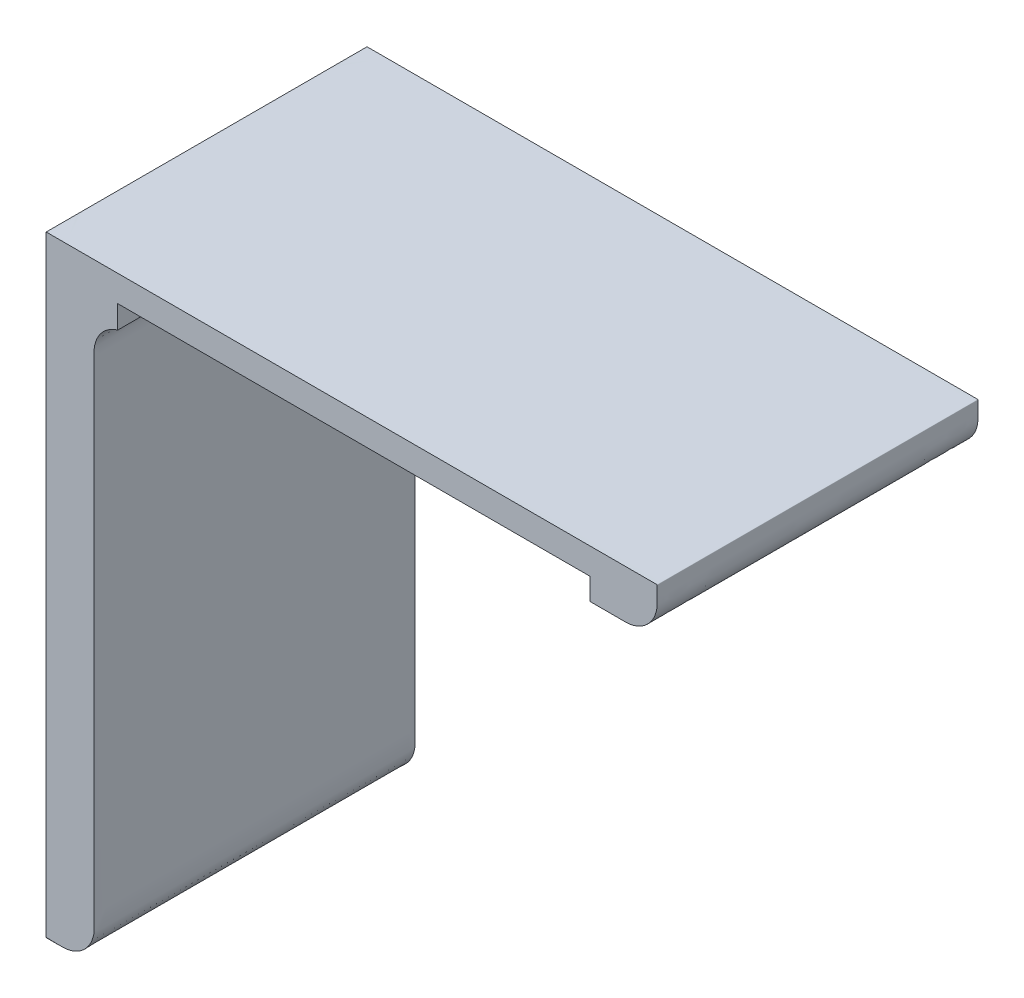
ISO-10303-21;
HEADER;
FILE_DESCRIPTION(('STEP AP214'),'2;1');
FILE_NAME('part.step','',(''),(''),'','','');
FILE_SCHEMA(('AUTOMOTIVE_DESIGN { 1 0 10303 214 1 1 1 1 }'));
ENDSEC;
DATA;
#1=APPLICATION_CONTEXT('core data for automotive mechanical design processes');
#2=APPLICATION_PROTOCOL_DEFINITION('international standard','automotive_design',2000,#1);
#3=PRODUCT_CONTEXT('',#1,'mechanical');
#4=PRODUCT('Part','Part','',(#3));
#5=PRODUCT_RELATED_PRODUCT_CATEGORY('part','',(#4));
#6=PRODUCT_DEFINITION_FORMATION('','',#4);
#7=PRODUCT_DEFINITION_CONTEXT('part definition',#1,'design');
#8=PRODUCT_DEFINITION('design','',#6,#7);
#9=PRODUCT_DEFINITION_SHAPE('','',#8);
#10=(LENGTH_UNIT() NAMED_UNIT(*) SI_UNIT(.MILLI.,.METRE.));
#11=(NAMED_UNIT(*) PLANE_ANGLE_UNIT() SI_UNIT($,.RADIAN.));
#12=(NAMED_UNIT(*) SI_UNIT($,.STERADIAN.) SOLID_ANGLE_UNIT());
#13=UNCERTAINTY_MEASURE_WITH_UNIT(LENGTH_MEASURE(1.E-05),#10,'distance_accuracy_value','');
#14=(GEOMETRIC_REPRESENTATION_CONTEXT(3) GLOBAL_UNCERTAINTY_ASSIGNED_CONTEXT((#13)) GLOBAL_UNIT_ASSIGNED_CONTEXT((#10,
#11,#12)) REPRESENTATION_CONTEXT('',''));
#15=CARTESIAN_POINT('',(0.,0.,0.));
#16=DIRECTION('',(0.,0.,1.));
#17=DIRECTION('',(1.,0.,0.));
#18=AXIS2_PLACEMENT_3D('',#15,#16,#17);
#19=CARTESIAN_POINT('',(18.9059787704305,18.1559787704305,20.));
#20=CARTESIAN_POINT('',(18.9059787704305,18.3978101495289,20.));
#21=CARTESIAN_POINT('',(18.9059787704305,18.6396415286273,20.));
#22=CARTESIAN_POINT('',(18.9059787704305,18.8814729077257,20.));
#23=CARTESIAN_POINT('',(18.9059787704305,18.8853236325474,20.));
#24=CARTESIAN_POINT('',(18.9059787704305,18.8930250821906,20.));
#25=CARTESIAN_POINT('',(18.8930250821906,18.9059787704305,20.));
#26=CARTESIAN_POINT('',(18.8853236325474,18.9059787704305,20.));
#27=CARTESIAN_POINT('',(18.8814729077257,18.9059787704305,20.));
#28=CARTESIAN_POINT('',(6.19781014952889,18.9059787704305,20.));
#29=CARTESIAN_POINT('',(-6.48585260866795,18.9059787704305,20.));
#30=CARTESIAN_POINT('',(-19.1695153668648,18.9059787704305,20.));
#31=CARTESIAN_POINT('',(-19.1733660916864,18.9059787704305,20.));
#32=CARTESIAN_POINT('',(-19.1810675413297,18.9059787704305,20.));
#33=CARTESIAN_POINT('',(-19.1940212295695,18.8930250821906,20.));
#34=CARTESIAN_POINT('',(-19.1940212295695,18.8853236325474,20.));
#35=CARTESIAN_POINT('',(-19.1940212295695,18.8814729077257,20.));
#36=CARTESIAN_POINT('',(-19.1940212295695,6.19781014952888,20.));
#37=CARTESIAN_POINT('',(-19.1940212295695,-6.48585260866796,20.));
#38=CARTESIAN_POINT('',(-19.1940212295695,-19.1695153668648,20.));
#39=CARTESIAN_POINT('',(-19.1940212295695,-19.1733660916864,20.));
#40=CARTESIAN_POINT('',(-19.1940212295695,-19.1810675413297,20.));
#41=CARTESIAN_POINT('',(-19.1810675413297,-19.1940212295695,20.));
#42=CARTESIAN_POINT('',(-19.1733660916864,-19.1940212295695,20.));
#43=CARTESIAN_POINT('',(-19.1695153668648,-19.1940212295695,20.));
#44=CARTESIAN_POINT('',(-18.9276839877664,-19.1940212295695,20.));
#45=CARTESIAN_POINT('',(-18.685852608668,-19.1940212295695,20.));
#46=CARTESIAN_POINT('',(-18.4440212295696,-19.1940212295695,20.));
#47=CARTESIAN_POINT('',(-18.4162434517918,-19.1940212295695,20.));
#48=CARTESIAN_POINT('',(-18.3606878962362,-19.1940212295695,20.));
#49=CARTESIAN_POINT('',(-18.2773545629029,-19.1940212295695,20.));
#50=CARTESIAN_POINT('',(-18.2217990073473,-19.1940212295695,20.));
#51=CARTESIAN_POINT('',(-18.1940212295695,-19.1940212295695,20.));
#52=CARTESIAN_POINT('',(-18.1660825922262,-19.1940212295695,20.));
#53=CARTESIAN_POINT('',(-18.1102053175395,-19.1940212295695,20.));
#54=CARTESIAN_POINT('',(-18.0263712056586,-19.1875699605378,20.));
#55=CARTESIAN_POINT('',(-17.9707886299868,-19.181720345115,20.));
#56=CARTESIAN_POINT('',(-17.9430707985532,-19.1782147385733,20.));
#57=CARTESIAN_POINT('',(-17.2129226472993,-19.0858694141725,20.));
#58=CARTESIAN_POINT('',(-16.627903646982,-18.6393307809212,20.));
#59=CARTESIAN_POINT('',(-16.346262164547,-17.9593880942997,20.));
#60=CARTESIAN_POINT('',(-16.3130809049691,-17.8792814474101,20.));
#61=CARTESIAN_POINT('',(-16.2571370735047,-17.7147525918868,20.));
#62=CARTESIAN_POINT('',(-16.1940212295695,-17.4541416589244,20.));
#63=CARTESIAN_POINT('',(-16.1940212295695,-17.2807280393545,20.));
#64=CARTESIAN_POINT('',(-16.1940212295695,-17.1940212295695,20.));
#65=CARTESIAN_POINT('',(-16.1940212295695,-17.1073144197846,20.));
#66=CARTESIAN_POINT('',(-16.1940212295695,-16.9339008002147,20.));
#67=CARTESIAN_POINT('',(-16.1940212295695,-16.6737803708599,20.));
#68=CARTESIAN_POINT('',(-16.1940212295695,-16.50036675129,20.));
#69=CARTESIAN_POINT('',(-16.1940212295695,-16.413659941505,20.));
#70=CARTESIAN_POINT('',(-16.1940212295695,-6.56723413354804,20.));
#71=CARTESIAN_POINT('',(-16.1940212295695,3.27919167440895,20.));
#72=CARTESIAN_POINT('',(-16.1940212295696,13.1256174823659,20.));
#73=CARTESIAN_POINT('',(-16.1940212295696,13.2123242921509,20.));
#74=CARTESIAN_POINT('',(-16.1940212295696,13.3857379117208,20.));
#75=CARTESIAN_POINT('',(-16.1940212295696,13.6458583410756,20.));
#76=CARTESIAN_POINT('',(-16.1940212295696,13.8192719606455,20.));
#77=CARTESIAN_POINT('',(-16.1940212295696,13.9059787704305,20.));
#78=CARTESIAN_POINT('',(-16.1940212295696,13.9926855802154,20.));
#79=CARTESIAN_POINT('',(-16.1940212295696,14.1660991997853,20.));
#80=CARTESIAN_POINT('',(-16.1309053856344,14.4267101327477,20.));
#81=CARTESIAN_POINT('',(-16.07496155417,14.591238988271,20.));
#82=CARTESIAN_POINT('',(-16.0417802945921,14.6713456351606,20.));
#83=CARTESIAN_POINT('',(-15.8360794525434,15.1679513978261,20.));
#84=CARTESIAN_POINT('',(-15.4559938569652,15.5480369934044,20.));
#85=CARTESIAN_POINT('',(-14.9593880942997,15.753737835453,20.));
#86=CARTESIAN_POINT('',(-14.8792814474101,15.786919095031,20.));
#87=CARTESIAN_POINT('',(-14.7147525918868,15.8428629264953,20.));
#88=CARTESIAN_POINT('',(-14.4541416589244,15.9059787704305,20.));
#89=CARTESIAN_POINT('',(-14.2807280393545,15.9059787704305,20.));
#90=CARTESIAN_POINT('',(-14.1940212295695,15.9059787704305,20.));
#91=CARTESIAN_POINT('',(-14.1073144197846,15.9059787704305,20.));
#92=CARTESIAN_POINT('',(-13.9339008002147,15.9059787704305,20.));
#93=CARTESIAN_POINT('',(-13.6737803708599,15.9059787704305,20.));
#94=CARTESIAN_POINT('',(-13.50036675129,15.9059787704305,20.));
#95=CARTESIAN_POINT('',(-13.413659941505,15.9059787704305,20.));
#96=CARTESIAN_POINT('',(-3.56723413354803,15.9059787704305,20.));
#97=CARTESIAN_POINT('',(6.27919167440896,15.9059787704305,20.));
#98=CARTESIAN_POINT('',(16.1256174823659,15.9059787704305,20.));
#99=CARTESIAN_POINT('',(16.2123242921509,15.9059787704305,20.));
#100=CARTESIAN_POINT('',(16.3857379117208,15.9059787704305,20.));
#101=CARTESIAN_POINT('',(16.6458583410756,15.9059787704305,20.));
#102=CARTESIAN_POINT('',(16.8192719606455,15.9059787704305,20.));
#103=CARTESIAN_POINT('',(16.9059787704305,15.9059787704305,20.));
#104=CARTESIAN_POINT('',(16.9926855802154,15.9059787704305,20.));
#105=CARTESIAN_POINT('',(17.1660991997853,15.9059787704305,20.));
#106=CARTESIAN_POINT('',(17.4267101327477,15.9690946143657,20.));
#107=CARTESIAN_POINT('',(17.591238988271,16.02503844583,20.));
#108=CARTESIAN_POINT('',(17.6713456351606,16.0582197054079,20.));
#109=CARTESIAN_POINT('',(18.3512883217821,16.3398611878429,20.));
#110=CARTESIAN_POINT('',(18.7978269550334,16.9248801881602,20.));
#111=CARTESIAN_POINT('',(18.8901722794342,17.6550283394142,20.));
#112=CARTESIAN_POINT('',(18.8936778859759,17.6827461708477,20.));
#113=CARTESIAN_POINT('',(18.8995275013987,17.7383287465196,20.));
#114=CARTESIAN_POINT('',(18.9059787704305,17.8221628584004,20.));
#115=CARTESIAN_POINT('',(18.9059787704305,17.8780401330871,20.));
#116=CARTESIAN_POINT('',(18.9059787704305,17.9059787704305,20.));
#117=CARTESIAN_POINT('',(18.9059787704305,17.9337565482082,20.));
#118=CARTESIAN_POINT('',(18.9059787704305,17.9893121037638,20.));
#119=CARTESIAN_POINT('',(18.9059787704305,18.0726454370971,20.));
#120=CARTESIAN_POINT('',(18.9059787704305,18.1282009926527,20.));
#121=CARTESIAN_POINT('',(18.9059787704305,18.1559787704305,20.));
#122=(BOUNDED_CURVE() B_SPLINE_CURVE(3,(#19,#20,#21,#22,#23,#24,#25,#26,#27,#28,#29,#30,#31,#32,
#33,#34,#35,#36,#37,#38,#39,#40,#41,#42,#43,#44,#45,#46,#47,#48,#49,#50,#51,#52,#53,#54,#55,#56,
#57,#58,#59,#60,#61,#62,#63,#64,#65,#66,#67,#68,#69,#70,#71,#72,#73,#74,#75,#76,#77,#78,#79,#80,
#81,#82,#83,#84,#85,#86,#87,#88,#89,#90,#91,#92,#93,#94,#95,#96,#97,#98,#99,#100,#101,#102,#103,
#104,#105,#106,#107,#108,#109,#110,#111,#112,#113,#114,#115,#116,#117,#118,#119,#120,#121),
.UNSPECIFIED.,.T.,.F.) B_SPLINE_CURVE_WITH_KNOTS((4,3,1,1,3,3,1,1,3,3,1,1,3,3,1,1,3,1,1,3,3,1,1,
3,1,1,3,3,1,1,3,1,1,3,3,1,1,3,1,1,3,3,1,1,3,1,1,3,3,1,1,3,1,1,4),(0.,0.00485184172848435,
0.0049290984825258,0.00500635523656724,0.00508361199060868,0.259554824410061,0.259632081164102,
0.259709337918143,0.259786594672185,0.514257807091866,0.514335063845908,0.514412320599949,
0.514489577353991,0.51934141908248,0.519898722199426,0.520456025316372,0.521013328433318,
0.521573858861606,0.522134389289895,0.522694919718183,0.536129143548748,0.537868734661477,
0.539608325774207,0.541347916886936,0.543087507999666,0.544827099112395,0.546566690225125,
0.744114666793005,0.745854257905734,0.747593849018464,0.749333440131193,0.751073031243923,
0.752812622356652,0.754552213469382,0.764789205613094,0.766528796725823,0.768268387838553,
0.770007978951282,0.771747570064012,0.773487161176741,0.775226752289471,0.972774728857354,
0.974514319970084,0.976253911082814,0.977993502195543,0.979733093308273,0.981472684421002,
0.983212275533732,0.996646499364297,0.997207029792585,0.997767560220874,0.998328090649162,
0.998885393766108,0.999442696883054,1.),
.UNSPECIFIED.) CURVE() GEOMETRIC_REPRESENTATION_ITEM() RATIONAL_B_SPLINE_CURVE((1.,1.,1.,1.,1.,
1.,1.,1.,1.,1.,1.,1.,1.,1.,1.,1.,1.,1.,1.,1.,1.,1.,1.,1.,1.,1.,1.,1.,1.,1.,1.,1.,1.,1.,1.,1.,1.,
1.,0.909832918896733,0.909832918896733,1.,1.,1.,1.,1.,1.,1.,1.,1.,1.,1.,1.,1.,1.,1.,1.,1.,1.,1.,
1.,1.,1.,1.,1.,0.949253021674191,0.949253021674191,1.,1.,1.,1.,1.,1.,1.,1.,1.,1.,1.,1.,1.,1.,1.,
1.,1.,1.,1.,1.,1.,1.,1.,1.,0.909832918896733,0.909832918896733,1.,1.,1.,1.,1.,1.,1.,1.,1.,1.,1.)) REPRESENTATION_ITEM(''));
#123=DIRECTION('',(0.,0.,-1.));
#124=VECTOR('',#123,1.);
#125=SURFACE_OF_LINEAR_EXTRUSION('',#122,#124);
#126=CARTESIAN_POINT('',(18.9059787704305,18.1559787704305,0.));
#127=CARTESIAN_POINT('',(18.9059787704305,18.3978101495289,0.));
#128=CARTESIAN_POINT('',(18.9059787704305,18.6396415286273,0.));
#129=CARTESIAN_POINT('',(18.9059787704305,18.8814729077257,0.));
#130=CARTESIAN_POINT('',(18.9059787704305,18.8853236325474,0.));
#131=CARTESIAN_POINT('',(18.9059787704305,18.8930250821906,0.));
#132=CARTESIAN_POINT('',(18.8930250821906,18.9059787704305,0.));
#133=CARTESIAN_POINT('',(18.8853236325474,18.9059787704305,0.));
#134=CARTESIAN_POINT('',(18.8814729077257,18.9059787704305,0.));
#135=CARTESIAN_POINT('',(6.19781014952889,18.9059787704305,0.));
#136=CARTESIAN_POINT('',(-6.48585260866795,18.9059787704305,0.));
#137=CARTESIAN_POINT('',(-19.1695153668648,18.9059787704305,0.));
#138=CARTESIAN_POINT('',(-19.1733660916864,18.9059787704305,0.));
#139=CARTESIAN_POINT('',(-19.1810675413297,18.9059787704305,0.));
#140=CARTESIAN_POINT('',(-19.1940212295695,18.8930250821906,0.));
#141=CARTESIAN_POINT('',(-19.1940212295695,18.8853236325474,0.));
#142=CARTESIAN_POINT('',(-19.1940212295695,18.8814729077257,0.));
#143=CARTESIAN_POINT('',(-19.1940212295695,6.19781014952888,0.));
#144=CARTESIAN_POINT('',(-19.1940212295695,-6.48585260866796,0.));
#145=CARTESIAN_POINT('',(-19.1940212295695,-19.1695153668648,0.));
#146=CARTESIAN_POINT('',(-19.1940212295695,-19.1733660916864,0.));
#147=CARTESIAN_POINT('',(-19.1940212295695,-19.1810675413297,0.));
#148=CARTESIAN_POINT('',(-19.1810675413297,-19.1940212295695,0.));
#149=CARTESIAN_POINT('',(-19.1733660916864,-19.1940212295695,0.));
#150=CARTESIAN_POINT('',(-19.1695153668648,-19.1940212295695,0.));
#151=CARTESIAN_POINT('',(-18.9276839877664,-19.1940212295695,0.));
#152=CARTESIAN_POINT('',(-18.685852608668,-19.1940212295695,0.));
#153=CARTESIAN_POINT('',(-18.4440212295696,-19.1940212295695,0.));
#154=CARTESIAN_POINT('',(-18.4162434517918,-19.1940212295695,0.));
#155=CARTESIAN_POINT('',(-18.3606878962362,-19.1940212295695,0.));
#156=CARTESIAN_POINT('',(-18.2773545629029,-19.1940212295695,0.));
#157=CARTESIAN_POINT('',(-18.2217990073473,-19.1940212295695,0.));
#158=CARTESIAN_POINT('',(-18.1940212295695,-19.1940212295695,0.));
#159=CARTESIAN_POINT('',(-18.1660825922262,-19.1940212295695,0.));
#160=CARTESIAN_POINT('',(-18.1102053175395,-19.1940212295695,0.));
#161=CARTESIAN_POINT('',(-18.0263712056586,-19.1875699605378,0.));
#162=CARTESIAN_POINT('',(-17.9707886299868,-19.181720345115,0.));
#163=CARTESIAN_POINT('',(-17.9430707985532,-19.1782147385733,0.));
#164=CARTESIAN_POINT('',(-17.2129226472993,-19.0858694141725,0.));
#165=CARTESIAN_POINT('',(-16.627903646982,-18.6393307809212,0.));
#166=CARTESIAN_POINT('',(-16.346262164547,-17.9593880942997,0.));
#167=CARTESIAN_POINT('',(-16.3130809049691,-17.8792814474101,0.));
#168=CARTESIAN_POINT('',(-16.2571370735047,-17.7147525918868,0.));
#169=CARTESIAN_POINT('',(-16.1940212295695,-17.4541416589244,0.));
#170=CARTESIAN_POINT('',(-16.1940212295695,-17.2807280393545,0.));
#171=CARTESIAN_POINT('',(-16.1940212295695,-17.1940212295695,0.));
#172=CARTESIAN_POINT('',(-16.1940212295695,-17.1073144197846,0.));
#173=CARTESIAN_POINT('',(-16.1940212295695,-16.9339008002147,0.));
#174=CARTESIAN_POINT('',(-16.1940212295695,-16.6737803708599,0.));
#175=CARTESIAN_POINT('',(-16.1940212295695,-16.50036675129,0.));
#176=CARTESIAN_POINT('',(-16.1940212295695,-16.413659941505,0.));
#177=CARTESIAN_POINT('',(-16.1940212295695,-6.56723413354804,0.));
#178=CARTESIAN_POINT('',(-16.1940212295695,3.27919167440895,0.));
#179=CARTESIAN_POINT('',(-16.1940212295696,13.1256174823659,0.));
#180=CARTESIAN_POINT('',(-16.1940212295696,13.2123242921509,0.));
#181=CARTESIAN_POINT('',(-16.1940212295696,13.3857379117208,0.));
#182=CARTESIAN_POINT('',(-16.1940212295696,13.6458583410756,0.));
#183=CARTESIAN_POINT('',(-16.1940212295696,13.8192719606455,0.));
#184=CARTESIAN_POINT('',(-16.1940212295696,13.9059787704305,0.));
#185=CARTESIAN_POINT('',(-16.1940212295696,13.9926855802154,0.));
#186=CARTESIAN_POINT('',(-16.1940212295696,14.1660991997853,0.));
#187=CARTESIAN_POINT('',(-16.1309053856344,14.4267101327477,0.));
#188=CARTESIAN_POINT('',(-16.07496155417,14.591238988271,0.));
#189=CARTESIAN_POINT('',(-16.0417802945921,14.6713456351606,0.));
#190=CARTESIAN_POINT('',(-15.8360794525434,15.1679513978261,0.));
#191=CARTESIAN_POINT('',(-15.4559938569652,15.5480369934044,0.));
#192=CARTESIAN_POINT('',(-14.9593880942997,15.753737835453,0.));
#193=CARTESIAN_POINT('',(-14.8792814474101,15.786919095031,0.));
#194=CARTESIAN_POINT('',(-14.7147525918868,15.8428629264953,0.));
#195=CARTESIAN_POINT('',(-14.4541416589244,15.9059787704305,0.));
#196=CARTESIAN_POINT('',(-14.2807280393545,15.9059787704305,0.));
#197=CARTESIAN_POINT('',(-14.1940212295695,15.9059787704305,0.));
#198=CARTESIAN_POINT('',(-14.1073144197846,15.9059787704305,0.));
#199=CARTESIAN_POINT('',(-13.9339008002147,15.9059787704305,0.));
#200=CARTESIAN_POINT('',(-13.6737803708599,15.9059787704305,0.));
#201=CARTESIAN_POINT('',(-13.50036675129,15.9059787704305,0.));
#202=CARTESIAN_POINT('',(-13.413659941505,15.9059787704305,0.));
#203=CARTESIAN_POINT('',(-3.56723413354803,15.9059787704305,0.));
#204=CARTESIAN_POINT('',(6.27919167440896,15.9059787704305,0.));
#205=CARTESIAN_POINT('',(16.1256174823659,15.9059787704305,0.));
#206=CARTESIAN_POINT('',(16.2123242921509,15.9059787704305,0.));
#207=CARTESIAN_POINT('',(16.3857379117208,15.9059787704305,0.));
#208=CARTESIAN_POINT('',(16.6458583410756,15.9059787704305,0.));
#209=CARTESIAN_POINT('',(16.8192719606455,15.9059787704305,0.));
#210=CARTESIAN_POINT('',(16.9059787704305,15.9059787704305,0.));
#211=CARTESIAN_POINT('',(16.9926855802154,15.9059787704305,0.));
#212=CARTESIAN_POINT('',(17.1660991997853,15.9059787704305,0.));
#213=CARTESIAN_POINT('',(17.4267101327477,15.9690946143657,0.));
#214=CARTESIAN_POINT('',(17.591238988271,16.02503844583,0.));
#215=CARTESIAN_POINT('',(17.6713456351606,16.0582197054079,0.));
#216=CARTESIAN_POINT('',(18.3512883217821,16.3398611878429,0.));
#217=CARTESIAN_POINT('',(18.7978269550334,16.9248801881602,0.));
#218=CARTESIAN_POINT('',(18.8901722794342,17.6550283394142,0.));
#219=CARTESIAN_POINT('',(18.8936778859759,17.6827461708477,0.));
#220=CARTESIAN_POINT('',(18.8995275013987,17.7383287465196,0.));
#221=CARTESIAN_POINT('',(18.9059787704305,17.8221628584004,0.));
#222=CARTESIAN_POINT('',(18.9059787704305,17.8780401330871,0.));
#223=CARTESIAN_POINT('',(18.9059787704305,17.9059787704305,0.));
#224=CARTESIAN_POINT('',(18.9059787704305,17.9337565482082,0.));
#225=CARTESIAN_POINT('',(18.9059787704305,17.9893121037638,0.));
#226=CARTESIAN_POINT('',(18.9059787704305,18.0726454370971,0.));
#227=CARTESIAN_POINT('',(18.9059787704305,18.1282009926527,0.));
#228=CARTESIAN_POINT('',(18.9059787704305,18.1559787704305,0.));
#229=(BOUNDED_CURVE() B_SPLINE_CURVE(3,(#126,#127,#128,#129,#130,#131,#132,#133,#134,#135,#136,
#137,#138,#139,#140,#141,#142,#143,#144,#145,#146,#147,#148,#149,#150,#151,#152,#153,#154,#155,
#156,#157,#158,#159,#160,#161,#162,#163,#164,#165,#166,#167,#168,#169,#170,#171,#172,#173,#174,
#175,#176,#177,#178,#179,#180,#181,#182,#183,#184,#185,#186,#187,#188,#189,#190,#191,#192,#193,
#194,#195,#196,#197,#198,#199,#200,#201,#202,#203,#204,#205,#206,#207,#208,#209,#210,#211,#212,
#213,#214,#215,#216,#217,#218,#219,#220,#221,#222,#223,#224,#225,#226,#227,#228),.UNSPECIFIED.,
.T.,.F.) B_SPLINE_CURVE_WITH_KNOTS((4,3,1,1,3,3,1,1,3,3,1,1,3,3,1,1,3,1,1,3,3,1,1,3,1,1,3,3,1,1,
3,1,1,3,3,1,1,3,1,1,3,3,1,1,3,1,1,3,3,1,1,3,1,1,4),(0.,0.00485184172848435,0.0049290984825258,
0.00500635523656724,0.00508361199060868,0.259554824410061,0.259632081164102,0.259709337918143,
0.259786594672185,0.514257807091866,0.514335063845908,0.514412320599949,0.514489577353991,
0.51934141908248,0.519898722199426,0.520456025316372,0.521013328433318,0.521573858861606,
0.522134389289895,0.522694919718183,0.536129143548748,0.537868734661477,0.539608325774207,
0.541347916886936,0.543087507999666,0.544827099112395,0.546566690225125,0.744114666793005,
0.745854257905734,0.747593849018464,0.749333440131193,0.751073031243923,0.752812622356652,
0.754552213469382,0.764789205613094,0.766528796725823,0.768268387838553,0.770007978951282,
0.771747570064012,0.773487161176741,0.775226752289471,0.972774728857354,0.974514319970084,
0.976253911082814,0.977993502195543,0.979733093308273,0.981472684421002,0.983212275533732,
0.996646499364297,0.997207029792585,0.997767560220874,0.998328090649162,0.998885393766108,
0.999442696883054,1.),
.UNSPECIFIED.) CURVE() GEOMETRIC_REPRESENTATION_ITEM() RATIONAL_B_SPLINE_CURVE((1.,1.,1.,1.,1.,
1.,1.,1.,1.,1.,1.,1.,1.,1.,1.,1.,1.,1.,1.,1.,1.,1.,1.,1.,1.,1.,1.,1.,1.,1.,1.,1.,1.,1.,1.,1.,1.,
1.,0.909832918896733,0.909832918896733,1.,1.,1.,1.,1.,1.,1.,1.,1.,1.,1.,1.,1.,1.,1.,1.,1.,1.,1.,
1.,1.,1.,1.,1.,0.949253021674191,0.949253021674191,1.,1.,1.,1.,1.,1.,1.,1.,1.,1.,1.,1.,1.,1.,1.,
1.,1.,1.,1.,1.,1.,1.,1.,1.,0.909832918896733,0.909832918896733,1.,1.,1.,1.,1.,1.,1.,1.,1.,1.,1.)) REPRESENTATION_ITEM(''));
#230=CARTESIAN_POINT('',(14.7249954714797,15.9059787704305,0.));
#231=VERTEX_POINT('',#230);
#232=CARTESIAN_POINT('',(-14.7249954714797,15.8357302307877,0.));
#233=VERTEX_POINT('',#232);
#234=EDGE_CURVE('E97',#231,#233,#229,.T.);
#235=ORIENTED_EDGE('',*,*,#234,.T.);
#236=DIRECTION('',(0.,0.,-1.));
#237=VECTOR('',#236,1.);
#238=CARTESIAN_POINT('',(-14.7249954714796,15.8357302307877,20.));
#239=LINE('',#238,#237);
#240=CARTESIAN_POINT('',(-14.7249954714797,15.8357302307877,20.));
#241=VERTEX_POINT('',#240);
#242=EDGE_CURVE('E55',#233,#241,#239,.F.);
#243=ORIENTED_EDGE('',*,*,#242,.T.);
#244=CARTESIAN_POINT('',(14.7249954714797,15.9059787704305,20.));
#245=VERTEX_POINT('',#244);
#246=EDGE_CURVE('E98',#245,#241,#122,.T.);
#247=ORIENTED_EDGE('',*,*,#246,.F.);
#248=DIRECTION('',(0.,0.,-1.));
#249=VECTOR('',#248,1.);
#250=CARTESIAN_POINT('',(14.7249954714796,15.9059787704305,20.));
#251=LINE('',#250,#249);
#252=EDGE_CURVE('E85',#245,#231,#251,.T.);
#253=ORIENTED_EDGE('',*,*,#252,.T.);
#254=EDGE_LOOP('',(#235,#243,#247,#253));
#255=FACE_BOUND('',#254,.T.);
#256=ADVANCED_FACE('F33',(#255),#125,.F.);
#257=CARTESIAN_POINT('',(-19.1940212295695,-17.0375506337411,20.));
#258=DIRECTION('',(0.,0.,-1.));
#259=DIRECTION('',(-1.,0.,0.));
#260=AXIS2_PLACEMENT_3D('',#257,#258,#259);
#261=PLANE('',#260);
#262=ORIENTED_EDGE('',*,*,#246,.T.);
#263=DIRECTION('',(0.,-1.,0.));
#264=VECTOR('',#263,1.);
#265=CARTESIAN_POINT('',(-14.7249954714797,-17.267544050803,20.));
#266=LINE('',#265,#264);
#267=CARTESIAN_POINT('',(-14.7249954714797,17.267544050803,20.));
#268=VERTEX_POINT('',#267);
#269=EDGE_CURVE('E89',#268,#241,#266,.T.);
#270=ORIENTED_EDGE('',*,*,#269,.F.);
#271=DIRECTION('',(-1.,0.,0.));
#272=VECTOR('',#271,1.);
#273=CARTESIAN_POINT('',(14.7249954714797,17.267544050803,20.));
#274=LINE('',#273,#272);
#275=CARTESIAN_POINT('',(14.7249954714797,17.267544050803,20.));
#276=VERTEX_POINT('',#275);
#277=EDGE_CURVE('E75',#276,#268,#274,.T.);
#278=ORIENTED_EDGE('',*,*,#277,.F.);
#279=DIRECTION('',(0.,1.,0.));
#280=VECTOR('',#279,1.);
#281=CARTESIAN_POINT('',(14.7249954714797,-17.267544050803,20.));
#282=LINE('',#281,#280);
#283=EDGE_CURVE('E82',#245,#276,#282,.T.);
#284=ORIENTED_EDGE('',*,*,#283,.F.);
#285=EDGE_LOOP('',(#262,#270,#278,#284));
#286=FACE_BOUND('',#285,.T.);
#287=ADVANCED_FACE('F91',(#286),#261,.F.);
#288=CARTESIAN_POINT('',(-19.1940212295695,-17.0375506337411,0.));
#289=DIRECTION('',(0.,0.,-1.));
#290=DIRECTION('',(-1.,0.,0.));
#291=AXIS2_PLACEMENT_3D('',#288,#289,#290);
#292=PLANE('',#291);
#293=DIRECTION('',(0.,1.,0.));
#294=VECTOR('',#293,1.);
#295=CARTESIAN_POINT('',(-14.7249954714797,-17.0375506337411,0.));
#296=LINE('',#295,#294);
#297=CARTESIAN_POINT('',(-14.7249954714797,17.267544050803,0.));
#298=VERTEX_POINT('',#297);
#299=EDGE_CURVE('E11',#233,#298,#296,.T.);
#300=ORIENTED_EDGE('',*,*,#299,.F.);
#301=ORIENTED_EDGE('',*,*,#234,.F.);
#302=DIRECTION('',(0.,-1.,0.));
#303=VECTOR('',#302,1.);
#304=CARTESIAN_POINT('',(14.7249954714797,-17.0375506337411,0.));
#305=LINE('',#304,#303);
#306=CARTESIAN_POINT('',(14.7249954714797,17.267544050803,0.));
#307=VERTEX_POINT('',#306);
#308=EDGE_CURVE('E103',#307,#231,#305,.T.);
#309=ORIENTED_EDGE('',*,*,#308,.F.);
#310=DIRECTION('',(1.,0.,0.));
#311=VECTOR('',#310,1.);
#312=CARTESIAN_POINT('',(-19.1940212295695,17.267544050803,0.));
#313=LINE('',#312,#311);
#314=EDGE_CURVE('E41',#298,#307,#313,.T.);
#315=ORIENTED_EDGE('',*,*,#314,.F.);
#316=EDGE_LOOP('',(#300,#301,#309,#315));
#317=FACE_BOUND('',#316,.T.);
#318=ADVANCED_FACE('F117',(#317),#292,.T.);
#319=CARTESIAN_POINT('',(-14.7249954714797,-17.267544050803,-23.));
#320=DIRECTION('',(-1.,0.,0.));
#321=DIRECTION('',(0.,0.,1.));
#322=AXIS2_PLACEMENT_3D('',#319,#320,#321);
#323=PLANE('',#322);
#324=ORIENTED_EDGE('',*,*,#299,.T.);
#325=DIRECTION('',(0.,0.,1.));
#326=VECTOR('',#325,1.);
#327=CARTESIAN_POINT('',(-14.7249954714797,17.267544050803,-23.));
#328=LINE('',#327,#326);
#329=EDGE_CURVE('E79',#298,#268,#328,.T.);
#330=ORIENTED_EDGE('',*,*,#329,.T.);
#331=ORIENTED_EDGE('',*,*,#269,.T.);
#332=ORIENTED_EDGE('',*,*,#242,.F.);
#333=EDGE_LOOP('',(#324,#330,#331,#332));
#334=FACE_BOUND('',#333,.T.);
#335=ADVANCED_FACE('F118',(#334),#323,.F.);
#336=CARTESIAN_POINT('',(14.7249954714797,-17.267544050803,-23.));
#337=DIRECTION('',(1.,0.,0.));
#338=DIRECTION('',(0.,0.,-1.));
#339=AXIS2_PLACEMENT_3D('',#336,#337,#338);
#340=PLANE('',#339);
#341=ORIENTED_EDGE('',*,*,#283,.T.);
#342=DIRECTION('',(0.,0.,1.));
#343=VECTOR('',#342,1.);
#344=CARTESIAN_POINT('',(14.7249954714797,17.267544050803,-23.));
#345=LINE('',#344,#343);
#346=EDGE_CURVE('E48',#307,#276,#345,.T.);
#347=ORIENTED_EDGE('',*,*,#346,.F.);
#348=ORIENTED_EDGE('',*,*,#308,.T.);
#349=ORIENTED_EDGE('',*,*,#252,.F.);
#350=EDGE_LOOP('',(#341,#347,#348,#349));
#351=FACE_BOUND('',#350,.T.);
#352=ADVANCED_FACE('F83',(#351),#340,.F.);
#353=CARTESIAN_POINT('',(14.7249954714797,17.267544050803,-23.));
#354=DIRECTION('',(0.,1.,0.));
#355=DIRECTION('',(0.,0.,1.));
#356=AXIS2_PLACEMENT_3D('',#353,#354,#355);
#357=PLANE('',#356);
#358=ORIENTED_EDGE('',*,*,#314,.T.);
#359=ORIENTED_EDGE('',*,*,#346,.T.);
#360=ORIENTED_EDGE('',*,*,#277,.T.);
#361=ORIENTED_EDGE('',*,*,#329,.F.);
#362=EDGE_LOOP('',(#358,#359,#360,#361));
#363=FACE_BOUND('',#362,.T.);
#364=ADVANCED_FACE('F72',(#363),#357,.F.);
#365=CLOSED_SHELL('',(#256,#287,#318,#335,#352,#364));
#366=MANIFOLD_SOLID_BREP('B2',#365);
#367=ADVANCED_BREP_SHAPE_REPRESENTATION('',(#18,#366),#14);
#368=SHAPE_DEFINITION_REPRESENTATION(#9,#367);
ENDSEC;
END-ISO-10303-21;
